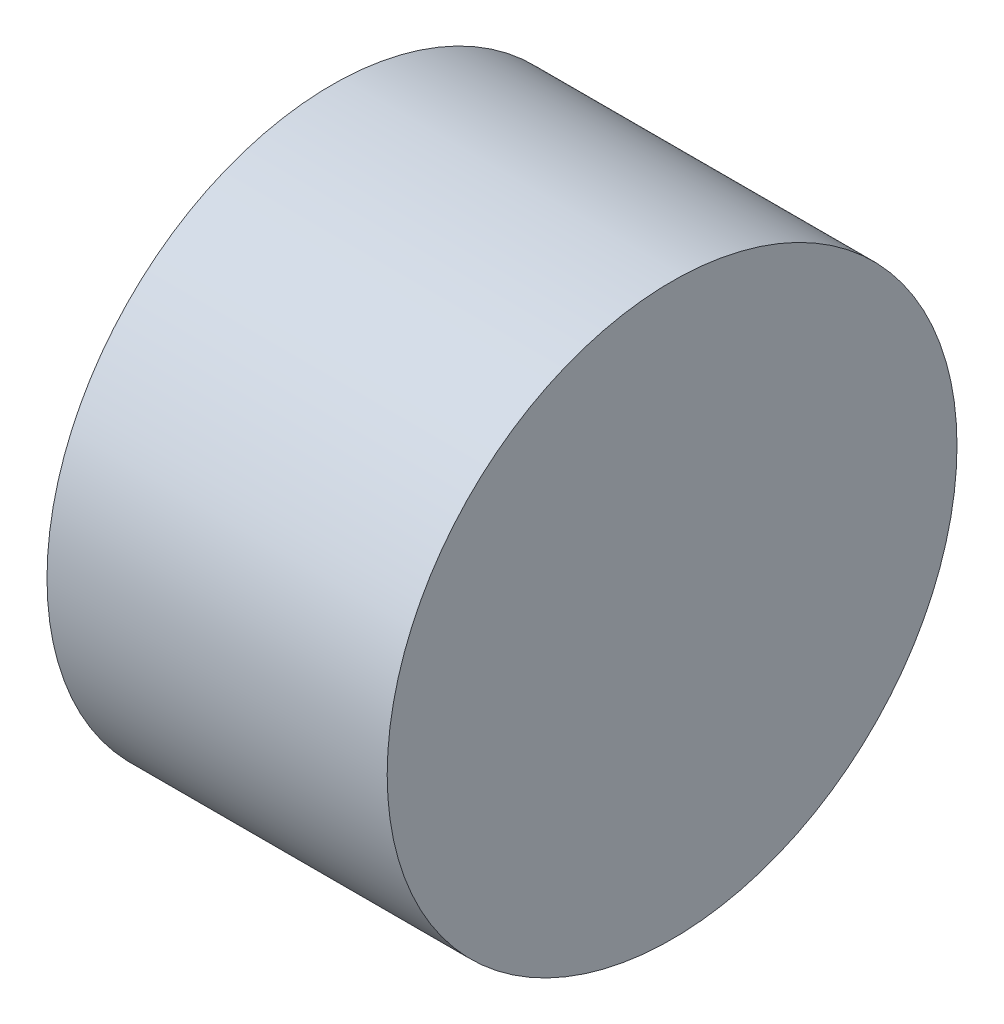
ISO-10303-21;
HEADER;
FILE_DESCRIPTION(('STEP AP214'),'2;1');
FILE_NAME('part.step','',(''),(''),'','','');
FILE_SCHEMA(('AUTOMOTIVE_DESIGN { 1 0 10303 214 1 1 1 1 }'));
ENDSEC;
DATA;
#1=APPLICATION_CONTEXT('core data for automotive mechanical design processes');
#2=APPLICATION_PROTOCOL_DEFINITION('international standard','automotive_design',2000,#1);
#3=PRODUCT_CONTEXT('',#1,'mechanical');
#4=PRODUCT('Part','Part','',(#3));
#5=PRODUCT_RELATED_PRODUCT_CATEGORY('part','',(#4));
#6=PRODUCT_DEFINITION_FORMATION('','',#4);
#7=PRODUCT_DEFINITION_CONTEXT('part definition',#1,'design');
#8=PRODUCT_DEFINITION('design','',#6,#7);
#9=PRODUCT_DEFINITION_SHAPE('','',#8);
#10=(LENGTH_UNIT() NAMED_UNIT(*) SI_UNIT(.MILLI.,.METRE.));
#11=(NAMED_UNIT(*) PLANE_ANGLE_UNIT() SI_UNIT($,.RADIAN.));
#12=(NAMED_UNIT(*) SI_UNIT($,.STERADIAN.) SOLID_ANGLE_UNIT());
#13=UNCERTAINTY_MEASURE_WITH_UNIT(LENGTH_MEASURE(1.E-05),#10,'distance_accuracy_value','');
#14=(GEOMETRIC_REPRESENTATION_CONTEXT(3) GLOBAL_UNCERTAINTY_ASSIGNED_CONTEXT((#13)) GLOBAL_UNIT_ASSIGNED_CONTEXT((#10,
#11,#12)) REPRESENTATION_CONTEXT('',''));
#15=CARTESIAN_POINT('',(0.,0.,0.));
#16=DIRECTION('',(0.,0.,1.));
#17=DIRECTION('',(1.,0.,0.));
#18=AXIS2_PLACEMENT_3D('',#15,#16,#17);
#19=CARTESIAN_POINT('',(40.,0.,0.));
#20=DIRECTION('',(-1.,0.,0.));
#21=DIRECTION('',(0.,0.,1.));
#22=AXIS2_PLACEMENT_3D('',#19,#20,#21);
#23=CYLINDRICAL_SURFACE('',#22,33.5);
#24=CARTESIAN_POINT('',(40.,0.,0.));
#25=DIRECTION('',(1.,0.,0.));
#26=DIRECTION('',(0.,0.,-1.));
#27=AXIS2_PLACEMENT_3D('',#24,#25,#26);
#28=CIRCLE('',#27,33.5);
#29=CARTESIAN_POINT('',(40.,0.,-33.5));
#30=VERTEX_POINT('',#29);
#31=EDGE_CURVE('E10',#30,#30,#28,.T.);
#32=ORIENTED_EDGE('',*,*,#31,.F.);
#33=EDGE_LOOP('',(#32));
#34=FACE_BOUND('',#33,.T.);
#35=CARTESIAN_POINT('',(0.,0.,0.));
#36=DIRECTION('',(1.,0.,0.));
#37=DIRECTION('',(0.,0.,-1.));
#38=AXIS2_PLACEMENT_3D('',#35,#36,#37);
#39=CIRCLE('',#38,33.5);
#40=CARTESIAN_POINT('',(0.,0.,-33.5));
#41=VERTEX_POINT('',#40);
#42=EDGE_CURVE('E42',#41,#41,#39,.T.);
#43=ORIENTED_EDGE('',*,*,#42,.T.);
#44=EDGE_LOOP('',(#43));
#45=FACE_BOUND('',#44,.T.);
#46=ADVANCED_FACE('F39',(#34,#45),#23,.T.);
#47=CARTESIAN_POINT('',(40.,0.,0.));
#48=DIRECTION('',(1.,0.,0.));
#49=DIRECTION('',(0.,0.,-1.));
#50=AXIS2_PLACEMENT_3D('',#47,#48,#49);
#51=PLANE('',#50);
#52=ORIENTED_EDGE('',*,*,#31,.T.);
#53=EDGE_LOOP('',(#52));
#54=FACE_BOUND('',#53,.T.);
#55=ADVANCED_FACE('F54',(#54),#51,.T.);
#56=CARTESIAN_POINT('',(0.,0.,0.));
#57=DIRECTION('',(1.,0.,0.));
#58=DIRECTION('',(0.,0.,-1.));
#59=AXIS2_PLACEMENT_3D('',#56,#57,#58);
#60=PLANE('',#59);
#61=ORIENTED_EDGE('',*,*,#42,.F.);
#62=EDGE_LOOP('',(#61));
#63=FACE_BOUND('',#62,.T.);
#64=ADVANCED_FACE('F52',(#63),#60,.F.);
#65=CLOSED_SHELL('',(#46,#55,#64));
#66=MANIFOLD_SOLID_BREP('B2',#65);
#67=ADVANCED_BREP_SHAPE_REPRESENTATION('',(#18,#66),#14);
#68=SHAPE_DEFINITION_REPRESENTATION(#9,#67);
ENDSEC;
END-ISO-10303-21;
